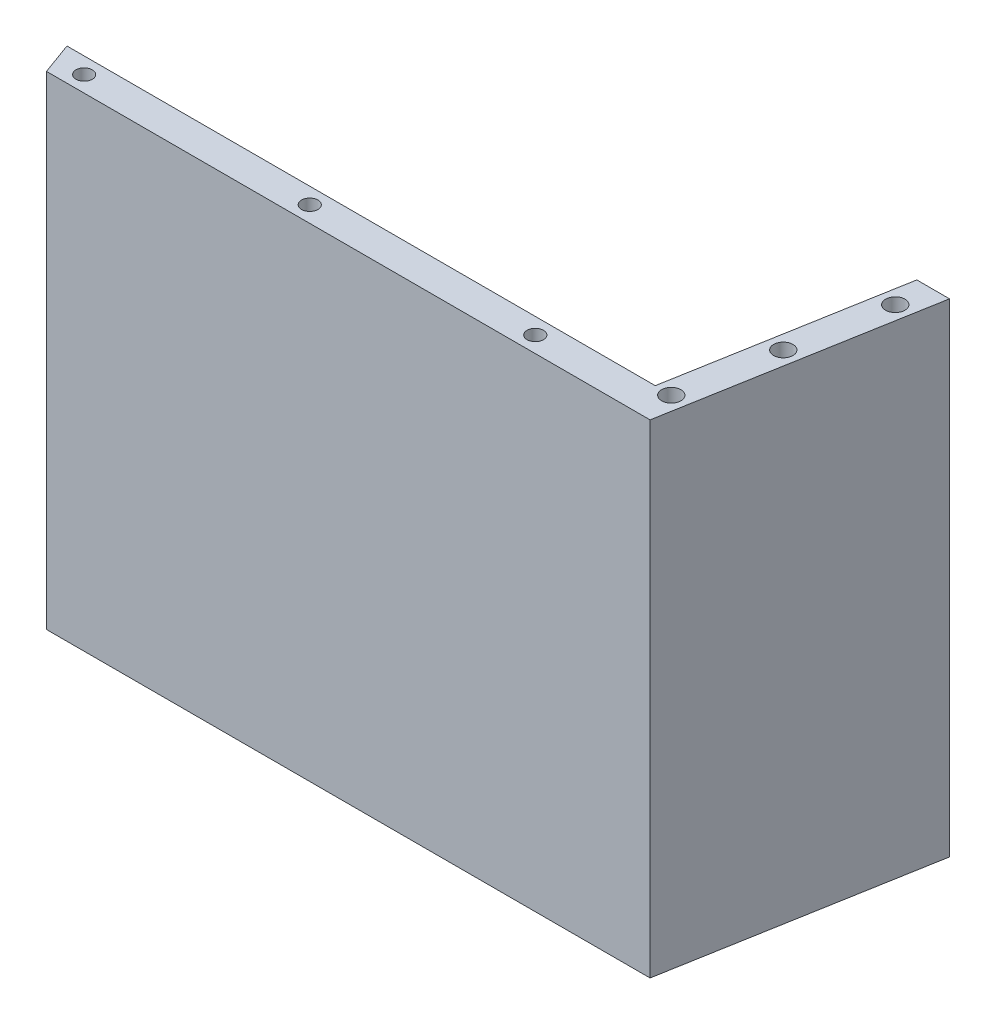
ISO-10303-21;
HEADER;
FILE_DESCRIPTION(('STEP AP214'),'2;1');
FILE_NAME('part.step','',(''),(''),'','','');
FILE_SCHEMA(('AUTOMOTIVE_DESIGN { 1 0 10303 214 1 1 1 1 }'));
ENDSEC;
DATA;
#1=APPLICATION_CONTEXT('core data for automotive mechanical design processes');
#2=APPLICATION_PROTOCOL_DEFINITION('international standard','automotive_design',2000,#1);
#3=PRODUCT_CONTEXT('',#1,'mechanical');
#4=PRODUCT('Part','Part','',(#3));
#5=PRODUCT_RELATED_PRODUCT_CATEGORY('part','',(#4));
#6=PRODUCT_DEFINITION_FORMATION('','',#4);
#7=PRODUCT_DEFINITION_CONTEXT('part definition',#1,'design');
#8=PRODUCT_DEFINITION('design','',#6,#7);
#9=PRODUCT_DEFINITION_SHAPE('','',#8);
#10=(LENGTH_UNIT() NAMED_UNIT(*) SI_UNIT(.MILLI.,.METRE.));
#11=(NAMED_UNIT(*) PLANE_ANGLE_UNIT() SI_UNIT($,.RADIAN.));
#12=(NAMED_UNIT(*) SI_UNIT($,.STERADIAN.) SOLID_ANGLE_UNIT());
#13=UNCERTAINTY_MEASURE_WITH_UNIT(LENGTH_MEASURE(1.E-05),#10,'distance_accuracy_value','');
#14=(GEOMETRIC_REPRESENTATION_CONTEXT(3) GLOBAL_UNCERTAINTY_ASSIGNED_CONTEXT((#13)) GLOBAL_UNIT_ASSIGNED_CONTEXT((#10,
#11,#12)) REPRESENTATION_CONTEXT('',''));
#15=CARTESIAN_POINT('',(0.,0.,0.));
#16=DIRECTION('',(0.,0.,1.));
#17=DIRECTION('',(1.,0.,0.));
#18=AXIS2_PLACEMENT_3D('',#15,#16,#17);
#19=CARTESIAN_POINT('',(72.4910535791554,37.5,-52.5));
#20=DIRECTION('',(0.,0.,1.));
#21=DIRECTION('',(1.,0.,0.));
#22=AXIS2_PLACEMENT_3D('',#19,#20,#21);
#23=PLANE('',#22);
#24=DIRECTION('',(0.,-1.,0.));
#25=VECTOR('',#24,1.);
#26=CARTESIAN_POINT('',(72.4910535791554,37.5,-52.5));
#27=LINE('',#26,#25);
#28=CARTESIAN_POINT('',(72.4910535791554,37.5,-52.5));
#29=VERTEX_POINT('',#28);
#30=CARTESIAN_POINT('',(72.4910535791554,-37.5,-52.5));
#31=VERTEX_POINT('',#30);
#32=EDGE_CURVE('E116',#29,#31,#27,.T.);
#33=ORIENTED_EDGE('',*,*,#32,.T.);
#34=DIRECTION('',(-1.,0.,0.));
#35=VECTOR('',#34,1.);
#36=CARTESIAN_POINT('',(72.4910535791554,-37.5,-52.5));
#37=LINE('',#36,#35);
#38=CARTESIAN_POINT('',(67.4139205197266,-37.5,-52.5));
#39=VERTEX_POINT('',#38);
#40=EDGE_CURVE('E110',#31,#39,#37,.T.);
#41=ORIENTED_EDGE('',*,*,#40,.T.);
#42=DIRECTION('',(0.,-1.,0.));
#43=VECTOR('',#42,1.);
#44=CARTESIAN_POINT('',(67.4139205197266,37.5,-52.5));
#45=LINE('',#44,#43);
#46=CARTESIAN_POINT('',(67.4139205197266,37.5,-52.5));
#47=VERTEX_POINT('',#46);
#48=EDGE_CURVE('E11',#47,#39,#45,.T.);
#49=ORIENTED_EDGE('',*,*,#48,.F.);
#50=DIRECTION('',(-1.,0.,0.));
#51=VECTOR('',#50,1.);
#52=CARTESIAN_POINT('',(72.4910535791554,37.5,-52.5));
#53=LINE('',#52,#51);
#54=EDGE_CURVE('E185',#29,#47,#53,.T.);
#55=ORIENTED_EDGE('',*,*,#54,.F.);
#56=EDGE_LOOP('',(#33,#41,#49,#55));
#57=FACE_BOUND('',#56,.T.);
#58=ADVANCED_FACE('F45',(#57),#23,.F.);
#59=CARTESIAN_POINT('',(61.3306396852845,37.5,-18.));
#60=DIRECTION('',(0.984807753012207,0.,0.173648177666934));
#61=DIRECTION('',(0.173648177666934,0.,-0.984807753012208));
#62=AXIS2_PLACEMENT_3D('',#59,#60,#61);
#63=PLANE('',#62);
#64=ORIENTED_EDGE('',*,*,#48,.T.);
#65=DIRECTION('',(-0.173648177666934,0.,0.984807753012207));
#66=VECTOR('',#65,1.);
#67=CARTESIAN_POINT('',(61.3306396852845,-37.5,-18.));
#68=LINE('',#67,#66);
#69=CARTESIAN_POINT('',(61.3306396852845,-37.5,-18.));
#70=VERTEX_POINT('',#69);
#71=EDGE_CURVE('E100',#39,#70,#68,.T.);
#72=ORIENTED_EDGE('',*,*,#71,.T.);
#73=DIRECTION('',(0.,-1.,0.));
#74=VECTOR('',#73,1.);
#75=CARTESIAN_POINT('',(61.3306396852845,37.5,-18.));
#76=LINE('',#75,#74);
#77=CARTESIAN_POINT('',(61.3306396852845,37.5,-18.));
#78=VERTEX_POINT('',#77);
#79=EDGE_CURVE('E53',#78,#70,#76,.T.);
#80=ORIENTED_EDGE('',*,*,#79,.F.);
#81=DIRECTION('',(-0.173648177666934,0.,0.984807753012207));
#82=VECTOR('',#81,1.);
#83=CARTESIAN_POINT('',(61.3306396852845,37.5,-18.));
#84=LINE('',#83,#82);
#85=EDGE_CURVE('E101',#47,#78,#84,.T.);
#86=ORIENTED_EDGE('',*,*,#85,.F.);
#87=EDGE_LOOP('',(#64,#72,#80,#86));
#88=FACE_BOUND('',#87,.T.);
#89=ADVANCED_FACE('F98',(#88),#63,.F.);
#90=CARTESIAN_POINT('',(-29.9519733386605,37.5,-18.));
#91=DIRECTION('',(0.,0.,1.));
#92=DIRECTION('',(1.,0.,0.));
#93=AXIS2_PLACEMENT_3D('',#90,#91,#92);
#94=PLANE('',#93);
#95=ORIENTED_EDGE('',*,*,#79,.T.);
#96=DIRECTION('',(-1.,0.,0.));
#97=VECTOR('',#96,1.);
#98=CARTESIAN_POINT('',(-29.9519733386605,-37.5,-18.));
#99=LINE('',#98,#97);
#100=CARTESIAN_POINT('',(-29.9519733386605,-37.5,-18.));
#101=VERTEX_POINT('',#100);
#102=EDGE_CURVE('E113',#70,#101,#99,.T.);
#103=ORIENTED_EDGE('',*,*,#102,.T.);
#104=DIRECTION('',(0.,-1.,0.));
#105=VECTOR('',#104,1.);
#106=CARTESIAN_POINT('',(-29.9519733386605,37.5,-18.));
#107=LINE('',#106,#105);
#108=CARTESIAN_POINT('',(-29.9519733386605,37.5,-18.));
#109=VERTEX_POINT('',#108);
#110=EDGE_CURVE('E211',#109,#101,#107,.T.);
#111=ORIENTED_EDGE('',*,*,#110,.F.);
#112=DIRECTION('',(-1.,0.,0.));
#113=VECTOR('',#112,1.);
#114=CARTESIAN_POINT('',(-29.9519733386605,37.5,-18.));
#115=LINE('',#114,#113);
#116=EDGE_CURVE('E193',#78,#109,#115,.T.);
#117=ORIENTED_EDGE('',*,*,#116,.F.);
#118=EDGE_LOOP('',(#95,#103,#111,#117));
#119=FACE_BOUND('',#118,.T.);
#120=ADVANCED_FACE('F216',(#119),#94,.F.);
#121=CARTESIAN_POINT('',(-28.1321221673295,37.5,-13.));
#122=DIRECTION('',(0.939692620785907,0.,-0.342020143325673));
#123=DIRECTION('',(-0.342020143325673,0.,-0.939692620785907));
#124=AXIS2_PLACEMENT_3D('',#121,#122,#123);
#125=PLANE('',#124);
#126=ORIENTED_EDGE('',*,*,#110,.T.);
#127=DIRECTION('',(0.342020143325673,0.,0.939692620785907));
#128=VECTOR('',#127,1.);
#129=CARTESIAN_POINT('',(-28.1321221673295,-37.5,-13.));
#130=LINE('',#129,#128);
#131=CARTESIAN_POINT('',(-28.1321221673295,-37.5,-13.));
#132=VERTEX_POINT('',#131);
#133=EDGE_CURVE('E129',#101,#132,#130,.T.);
#134=ORIENTED_EDGE('',*,*,#133,.T.);
#135=DIRECTION('',(0.,-1.,0.));
#136=VECTOR('',#135,1.);
#137=CARTESIAN_POINT('',(-28.1321221673295,37.5,-13.));
#138=LINE('',#137,#136);
#139=CARTESIAN_POINT('',(-28.1321221673295,37.5,-13.));
#140=VERTEX_POINT('',#139);
#141=EDGE_CURVE('E208',#140,#132,#138,.T.);
#142=ORIENTED_EDGE('',*,*,#141,.F.);
#143=DIRECTION('',(0.342020143325673,0.,0.939692620785907));
#144=VECTOR('',#143,1.);
#145=CARTESIAN_POINT('',(-28.1321221673295,37.5,-13.));
#146=LINE('',#145,#144);
#147=EDGE_CURVE('E196',#109,#140,#146,.T.);
#148=ORIENTED_EDGE('',*,*,#147,.F.);
#149=EDGE_LOOP('',(#126,#134,#142,#148));
#150=FACE_BOUND('',#149,.T.);
#151=ADVANCED_FACE('F222',(#150),#125,.F.);
#152=CARTESIAN_POINT('',(-28.1321221673295,37.5,-13.));
#153=DIRECTION('',(0.,0.,-1.));
#154=DIRECTION('',(-1.,0.,0.));
#155=AXIS2_PLACEMENT_3D('',#152,#153,#154);
#156=PLANE('',#155);
#157=ORIENTED_EDGE('',*,*,#141,.T.);
#158=DIRECTION('',(1.,0.,0.));
#159=VECTOR('',#158,1.);
#160=CARTESIAN_POINT('',(-28.1321221673295,-37.5,-13.));
#161=LINE('',#160,#159);
#162=CARTESIAN_POINT('',(65.5261378411708,-37.5,-13.));
#163=VERTEX_POINT('',#162);
#164=EDGE_CURVE('E133',#132,#163,#161,.T.);
#165=ORIENTED_EDGE('',*,*,#164,.T.);
#166=DIRECTION('',(0.,-1.,0.));
#167=VECTOR('',#166,1.);
#168=CARTESIAN_POINT('',(65.5261378411708,37.5,-13.));
#169=LINE('',#168,#167);
#170=CARTESIAN_POINT('',(65.5261378411708,37.5,-13.));
#171=VERTEX_POINT('',#170);
#172=EDGE_CURVE('E205',#171,#163,#169,.T.);
#173=ORIENTED_EDGE('',*,*,#172,.F.);
#174=DIRECTION('',(1.,0.,0.));
#175=VECTOR('',#174,1.);
#176=CARTESIAN_POINT('',(-28.1321221673295,37.5,-13.));
#177=LINE('',#176,#175);
#178=EDGE_CURVE('E65',#140,#171,#177,.T.);
#179=ORIENTED_EDGE('',*,*,#178,.F.);
#180=EDGE_LOOP('',(#157,#165,#173,#179));
#181=FACE_BOUND('',#180,.T.);
#182=ADVANCED_FACE('F225',(#181),#156,.F.);
#183=CARTESIAN_POINT('',(65.5261378411708,37.5,-13.));
#184=DIRECTION('',(-0.984807753012207,0.,-0.173648177666934));
#185=DIRECTION('',(-0.173648177666934,0.,0.984807753012208));
#186=AXIS2_PLACEMENT_3D('',#183,#184,#185);
#187=PLANE('',#186);
#188=ORIENTED_EDGE('',*,*,#172,.T.);
#189=DIRECTION('',(0.173648177666934,0.,-0.984807753012207));
#190=VECTOR('',#189,1.);
#191=CARTESIAN_POINT('',(65.5261378411708,-37.5,-13.));
#192=LINE('',#191,#190);
#193=EDGE_CURVE('E137',#163,#31,#192,.T.);
#194=ORIENTED_EDGE('',*,*,#193,.T.);
#195=ORIENTED_EDGE('',*,*,#32,.F.);
#196=DIRECTION('',(0.173648177666934,0.,-0.984807753012207));
#197=VECTOR('',#196,1.);
#198=CARTESIAN_POINT('',(65.5261378411708,37.5,-13.));
#199=LINE('',#198,#197);
#200=EDGE_CURVE('E60',#171,#29,#199,.T.);
#201=ORIENTED_EDGE('',*,*,#200,.F.);
#202=EDGE_LOOP('',(#188,#194,#195,#201));
#203=FACE_BOUND('',#202,.T.);
#204=ADVANCED_FACE('F227',(#203),#187,.F.);
#205=CARTESIAN_POINT('',(0.,37.5,0.));
#206=DIRECTION('',(0.,-1.,0.));
#207=DIRECTION('',(0.,0.,-1.));
#208=AXIS2_PLACEMENT_3D('',#205,#206,#207);
#209=PLANE('',#208);
#210=CARTESIAN_POINT('',(10.2146633369087,37.5,-15.5));
#211=DIRECTION('',(0.,1.,0.));
#212=DIRECTION('',(0.,0.,1.));
#213=AXIS2_PLACEMENT_3D('',#210,#211,#212);
#214=CIRCLE('',#213,1.27158999222515);
#215=CARTESIAN_POINT('',(10.2146633369087,37.5,-14.2284100077748));
#216=VERTEX_POINT('',#215);
#217=EDGE_CURVE('E149',#216,#216,#214,.T.);
#218=ORIENTED_EDGE('',*,*,#217,.F.);
#219=EDGE_LOOP('',(#218));
#220=FACE_BOUND('',#219,.T.);
#221=CARTESIAN_POINT('',(-24.7853366630913,37.5,-15.5));
#222=DIRECTION('',(0.,1.,0.));
#223=DIRECTION('',(0.,0.,1.));
#224=AXIS2_PLACEMENT_3D('',#221,#222,#223);
#225=CIRCLE('',#224,1.27158999222515);
#226=CARTESIAN_POINT('',(-24.7853366630913,37.5,-14.2284100077748));
#227=VERTEX_POINT('',#226);
#228=EDGE_CURVE('E158',#227,#227,#225,.T.);
#229=ORIENTED_EDGE('',*,*,#228,.F.);
#230=EDGE_LOOP('',(#229));
#231=FACE_BOUND('',#230,.T.);
#232=CARTESIAN_POINT('',(69.0708521458987,37.5,-47.5));
#233=DIRECTION('',(0.,1.,0.));
#234=DIRECTION('',(0.,0.,1.));
#235=AXIS2_PLACEMENT_3D('',#232,#233,#234);
#236=CIRCLE('',#235,1.5);
#237=CARTESIAN_POINT('',(69.0708521458987,37.5,-46.));
#238=VERTEX_POINT('',#237);
#239=EDGE_CURVE('E166',#238,#238,#236,.T.);
#240=ORIENTED_EDGE('',*,*,#239,.F.);
#241=EDGE_LOOP('',(#240));
#242=FACE_BOUND('',#241,.T.);
#243=CARTESIAN_POINT('',(66.4661294808946,37.5,-32.7278837048169));
#244=DIRECTION('',(0.,1.,0.));
#245=DIRECTION('',(0.,0.,1.));
#246=AXIS2_PLACEMENT_3D('',#243,#244,#245);
#247=CIRCLE('',#246,1.5);
#248=CARTESIAN_POINT('',(66.4661294808946,37.5,-31.2278837048169));
#249=VERTEX_POINT('',#248);
#250=EDGE_CURVE('E174',#249,#249,#247,.T.);
#251=ORIENTED_EDGE('',*,*,#250,.F.);
#252=EDGE_LOOP('',(#251));
#253=FACE_BOUND('',#252,.T.);
#254=CARTESIAN_POINT('',(63.8614068158906,37.5,-17.9557674096338));
#255=DIRECTION('',(0.,1.,0.));
#256=DIRECTION('',(0.,0.,1.));
#257=AXIS2_PLACEMENT_3D('',#254,#255,#256);
#258=CIRCLE('',#257,1.5);
#259=CARTESIAN_POINT('',(63.8614068158906,37.5,-16.4557674096338));
#260=VERTEX_POINT('',#259);
#261=EDGE_CURVE('E141',#260,#260,#258,.T.);
#262=ORIENTED_EDGE('',*,*,#261,.F.);
#263=EDGE_LOOP('',(#262));
#264=FACE_BOUND('',#263,.T.);
#265=CARTESIAN_POINT('',(45.2146633369087,37.5,-15.5));
#266=DIRECTION('',(0.,1.,0.));
#267=DIRECTION('',(0.,0.,1.));
#268=AXIS2_PLACEMENT_3D('',#265,#266,#267);
#269=CIRCLE('',#268,1.27158999222515);
#270=CARTESIAN_POINT('',(45.2146633369087,37.5,-14.2284100077749));
#271=VERTEX_POINT('',#270);
#272=EDGE_CURVE('E153',#271,#271,#269,.T.);
#273=ORIENTED_EDGE('',*,*,#272,.F.);
#274=EDGE_LOOP('',(#273));
#275=FACE_BOUND('',#274,.T.);
#276=ORIENTED_EDGE('',*,*,#54,.T.);
#277=ORIENTED_EDGE('',*,*,#85,.T.);
#278=ORIENTED_EDGE('',*,*,#116,.T.);
#279=ORIENTED_EDGE('',*,*,#147,.T.);
#280=ORIENTED_EDGE('',*,*,#178,.T.);
#281=ORIENTED_EDGE('',*,*,#200,.T.);
#282=EDGE_LOOP('',(#276,#277,#278,#279,#280,#281));
#283=FACE_BOUND('',#282,.T.);
#284=ADVANCED_FACE('F219',(#220,#231,#242,#253,#264,#275,#283),#209,.F.);
#285=CARTESIAN_POINT('',(45.2146633369087,22.5,-15.5));
#286=DIRECTION('',(0.,1.,0.));
#287=DIRECTION('',(0.,0.,1.));
#288=AXIS2_PLACEMENT_3D('',#285,#286,#287);
#289=CYLINDRICAL_SURFACE('',#288,1.27158999222515);
#290=CARTESIAN_POINT('',(45.2146633369087,22.5,-15.5));
#291=DIRECTION('',(0.,1.,0.));
#292=DIRECTION('',(0.,0.,1.));
#293=AXIS2_PLACEMENT_3D('',#290,#291,#292);
#294=CIRCLE('',#293,1.27158999222515);
#295=CARTESIAN_POINT('',(45.2146633369087,22.5,-14.2284100077749));
#296=VERTEX_POINT('',#295);
#297=EDGE_CURVE('E181',#296,#296,#294,.T.);
#298=ORIENTED_EDGE('',*,*,#297,.F.);
#299=EDGE_LOOP('',(#298));
#300=FACE_BOUND('',#299,.T.);
#301=ORIENTED_EDGE('',*,*,#272,.T.);
#302=EDGE_LOOP('',(#301));
#303=FACE_BOUND('',#302,.T.);
#304=ADVANCED_FACE('F235',(#300,#303),#289,.F.);
#305=CARTESIAN_POINT('',(0.,22.5,0.));
#306=DIRECTION('',(0.,1.,0.));
#307=DIRECTION('',(0.,0.,1.));
#308=AXIS2_PLACEMENT_3D('',#305,#306,#307);
#309=PLANE('',#308);
#310=ORIENTED_EDGE('',*,*,#297,.T.);
#311=EDGE_LOOP('',(#310));
#312=FACE_BOUND('',#311,.T.);
#313=ADVANCED_FACE('F406',(#312),#309,.T.);
#314=CARTESIAN_POINT('',(63.8614068158906,22.5,-17.9557674096338));
#315=DIRECTION('',(0.,1.,0.));
#316=DIRECTION('',(0.,0.,1.));
#317=AXIS2_PLACEMENT_3D('',#314,#315,#316);
#318=CYLINDRICAL_SURFACE('',#317,1.5);
#319=CARTESIAN_POINT('',(63.8614068158906,22.5,-17.9557674096338));
#320=DIRECTION('',(0.,1.,0.));
#321=DIRECTION('',(0.,0.,1.));
#322=AXIS2_PLACEMENT_3D('',#319,#320,#321);
#323=CIRCLE('',#322,1.5);
#324=CARTESIAN_POINT('',(63.8614068158906,22.5,-16.4557674096338));
#325=VERTEX_POINT('',#324);
#326=EDGE_CURVE('E140',#325,#325,#323,.T.);
#327=ORIENTED_EDGE('',*,*,#326,.F.);
#328=EDGE_LOOP('',(#327));
#329=FACE_BOUND('',#328,.T.);
#330=ORIENTED_EDGE('',*,*,#261,.T.);
#331=EDGE_LOOP('',(#330));
#332=FACE_BOUND('',#331,.T.);
#333=ADVANCED_FACE('F402',(#329,#332),#318,.F.);
#334=CARTESIAN_POINT('',(63.8614068158906,22.5,-17.9557674096338));
#335=DIRECTION('',(0.,1.,0.));
#336=DIRECTION('',(0.,0.,1.));
#337=AXIS2_PLACEMENT_3D('',#334,#335,#336);
#338=PLANE('',#337);
#339=ORIENTED_EDGE('',*,*,#326,.T.);
#340=EDGE_LOOP('',(#339));
#341=FACE_BOUND('',#340,.T.);
#342=ADVANCED_FACE('F405',(#341),#338,.T.);
#343=CARTESIAN_POINT('',(66.4661294808946,22.5,-32.7278837048169));
#344=DIRECTION('',(0.,1.,0.));
#345=DIRECTION('',(0.,0.,1.));
#346=AXIS2_PLACEMENT_3D('',#343,#344,#345);
#347=CYLINDRICAL_SURFACE('',#346,1.5);
#348=CARTESIAN_POINT('',(66.4661294808946,22.5,-32.7278837048169));
#349=DIRECTION('',(0.,1.,0.));
#350=DIRECTION('',(0.,0.,1.));
#351=AXIS2_PLACEMENT_3D('',#348,#349,#350);
#352=CIRCLE('',#351,1.5);
#353=CARTESIAN_POINT('',(66.4661294808946,22.5,-31.2278837048169));
#354=VERTEX_POINT('',#353);
#355=EDGE_CURVE('E145',#354,#354,#352,.T.);
#356=ORIENTED_EDGE('',*,*,#355,.F.);
#357=EDGE_LOOP('',(#356));
#358=FACE_BOUND('',#357,.T.);
#359=ORIENTED_EDGE('',*,*,#250,.T.);
#360=EDGE_LOOP('',(#359));
#361=FACE_BOUND('',#360,.T.);
#362=ADVANCED_FACE('F410',(#358,#361),#347,.F.);
#363=CARTESIAN_POINT('',(66.4661294808946,22.5,-32.7278837048169));
#364=DIRECTION('',(0.,1.,0.));
#365=DIRECTION('',(0.,0.,1.));
#366=AXIS2_PLACEMENT_3D('',#363,#364,#365);
#367=PLANE('',#366);
#368=ORIENTED_EDGE('',*,*,#355,.T.);
#369=EDGE_LOOP('',(#368));
#370=FACE_BOUND('',#369,.T.);
#371=ADVANCED_FACE('F430',(#370),#367,.T.);
#372=CARTESIAN_POINT('',(69.0708521458987,22.5,-47.5));
#373=DIRECTION('',(0.,1.,0.));
#374=DIRECTION('',(0.,0.,1.));
#375=AXIS2_PLACEMENT_3D('',#372,#373,#374);
#376=CYLINDRICAL_SURFACE('',#375,1.5);
#377=CARTESIAN_POINT('',(69.0708521458987,22.5,-47.5));
#378=DIRECTION('',(0.,1.,0.));
#379=DIRECTION('',(0.,0.,1.));
#380=AXIS2_PLACEMENT_3D('',#377,#378,#379);
#381=CIRCLE('',#380,1.5);
#382=CARTESIAN_POINT('',(69.0708521458987,22.5,-46.));
#383=VERTEX_POINT('',#382);
#384=EDGE_CURVE('E170',#383,#383,#381,.T.);
#385=ORIENTED_EDGE('',*,*,#384,.F.);
#386=EDGE_LOOP('',(#385));
#387=FACE_BOUND('',#386,.T.);
#388=ORIENTED_EDGE('',*,*,#239,.T.);
#389=EDGE_LOOP('',(#388));
#390=FACE_BOUND('',#389,.T.);
#391=ADVANCED_FACE('F427',(#387,#390),#376,.F.);
#392=CARTESIAN_POINT('',(69.0708521458987,22.5,-47.5));
#393=DIRECTION('',(0.,1.,0.));
#394=DIRECTION('',(0.,0.,1.));
#395=AXIS2_PLACEMENT_3D('',#392,#393,#394);
#396=PLANE('',#395);
#397=ORIENTED_EDGE('',*,*,#384,.T.);
#398=EDGE_LOOP('',(#397));
#399=FACE_BOUND('',#398,.T.);
#400=ADVANCED_FACE('F422',(#399),#396,.T.);
#401=CARTESIAN_POINT('',(-24.7853366630913,22.5,-15.5));
#402=DIRECTION('',(0.,1.,0.));
#403=DIRECTION('',(0.,0.,1.));
#404=AXIS2_PLACEMENT_3D('',#401,#402,#403);
#405=CYLINDRICAL_SURFACE('',#404,1.27158999222515);
#406=CARTESIAN_POINT('',(-24.7853366630913,22.5,-15.5));
#407=DIRECTION('',(0.,1.,0.));
#408=DIRECTION('',(0.,0.,1.));
#409=AXIS2_PLACEMENT_3D('',#406,#407,#408);
#410=CIRCLE('',#409,1.27158999222515);
#411=CARTESIAN_POINT('',(-24.7853366630913,22.5,-14.2284100077748));
#412=VERTEX_POINT('',#411);
#413=EDGE_CURVE('E162',#412,#412,#410,.T.);
#414=ORIENTED_EDGE('',*,*,#413,.F.);
#415=EDGE_LOOP('',(#414));
#416=FACE_BOUND('',#415,.T.);
#417=ORIENTED_EDGE('',*,*,#228,.T.);
#418=EDGE_LOOP('',(#417));
#419=FACE_BOUND('',#418,.T.);
#420=ADVANCED_FACE('F419',(#416,#419),#405,.F.);
#421=CARTESIAN_POINT('',(0.,22.5,0.));
#422=DIRECTION('',(0.,1.,0.));
#423=DIRECTION('',(0.,0.,1.));
#424=AXIS2_PLACEMENT_3D('',#421,#422,#423);
#425=PLANE('',#424);
#426=ORIENTED_EDGE('',*,*,#413,.T.);
#427=EDGE_LOOP('',(#426));
#428=FACE_BOUND('',#427,.T.);
#429=ADVANCED_FACE('F415',(#428),#425,.T.);
#430=CARTESIAN_POINT('',(10.2146633369087,22.5,-15.5));
#431=DIRECTION('',(0.,1.,0.));
#432=DIRECTION('',(0.,0.,1.));
#433=AXIS2_PLACEMENT_3D('',#430,#431,#432);
#434=CYLINDRICAL_SURFACE('',#433,1.27158999222515);
#435=CARTESIAN_POINT('',(10.2146633369087,22.5,-15.5));
#436=DIRECTION('',(0.,1.,0.));
#437=DIRECTION('',(0.,0.,1.));
#438=AXIS2_PLACEMENT_3D('',#435,#436,#437);
#439=CIRCLE('',#438,1.27158999222515);
#440=CARTESIAN_POINT('',(10.2146633369087,22.5,-14.2284100077748));
#441=VERTEX_POINT('',#440);
#442=EDGE_CURVE('E154',#441,#441,#439,.T.);
#443=ORIENTED_EDGE('',*,*,#442,.F.);
#444=EDGE_LOOP('',(#443));
#445=FACE_BOUND('',#444,.T.);
#446=ORIENTED_EDGE('',*,*,#217,.T.);
#447=EDGE_LOOP('',(#446));
#448=FACE_BOUND('',#447,.T.);
#449=ADVANCED_FACE('F412',(#445,#448),#434,.F.);
#450=CARTESIAN_POINT('',(0.,22.5,0.));
#451=DIRECTION('',(0.,1.,0.));
#452=DIRECTION('',(0.,0.,1.));
#453=AXIS2_PLACEMENT_3D('',#450,#451,#452);
#454=PLANE('',#453);
#455=ORIENTED_EDGE('',*,*,#442,.T.);
#456=EDGE_LOOP('',(#455));
#457=FACE_BOUND('',#456,.T.);
#458=ADVANCED_FACE('F276',(#457),#454,.T.);
#459=CARTESIAN_POINT('',(0.,-37.5,0.));
#460=DIRECTION('',(0.,1.,0.));
#461=DIRECTION('',(0.,0.,-1.));
#462=AXIS2_PLACEMENT_3D('',#459,#460,#461);
#463=PLANE('',#462);
#464=CARTESIAN_POINT('',(10.2146633369087,-37.5,-15.5));
#465=DIRECTION('',(0.,1.,0.));
#466=DIRECTION('',(0.,0.,1.));
#467=AXIS2_PLACEMENT_3D('',#464,#465,#466);
#468=CIRCLE('',#467,1.27158999222515);
#469=CARTESIAN_POINT('',(10.2146633369087,-37.5,-14.2284100077748));
#470=VERTEX_POINT('',#469);
#471=EDGE_CURVE('E577',#470,#470,#468,.T.);
#472=ORIENTED_EDGE('',*,*,#471,.T.);
#473=EDGE_LOOP('',(#472));
#474=FACE_BOUND('',#473,.T.);
#475=CARTESIAN_POINT('',(-24.7853366630913,-37.5,-15.5));
#476=DIRECTION('',(0.,1.,0.));
#477=DIRECTION('',(0.,0.,1.));
#478=AXIS2_PLACEMENT_3D('',#475,#476,#477);
#479=CIRCLE('',#478,1.27158999222515);
#480=CARTESIAN_POINT('',(-24.7853366630913,-37.5,-14.2284100077748));
#481=VERTEX_POINT('',#480);
#482=EDGE_CURVE('E578',#481,#481,#479,.T.);
#483=ORIENTED_EDGE('',*,*,#482,.T.);
#484=EDGE_LOOP('',(#483));
#485=FACE_BOUND('',#484,.T.);
#486=CARTESIAN_POINT('',(69.0708521458987,-37.5,-47.5));
#487=DIRECTION('',(0.,1.,0.));
#488=DIRECTION('',(0.,0.,1.));
#489=AXIS2_PLACEMENT_3D('',#486,#487,#488);
#490=CIRCLE('',#489,1.5);
#491=CARTESIAN_POINT('',(69.0708521458987,-37.5,-46.));
#492=VERTEX_POINT('',#491);
#493=EDGE_CURVE('E592',#492,#492,#490,.T.);
#494=ORIENTED_EDGE('',*,*,#493,.T.);
#495=EDGE_LOOP('',(#494));
#496=FACE_BOUND('',#495,.T.);
#497=CARTESIAN_POINT('',(66.4661294808946,-37.5,-32.7278837048169));
#498=DIRECTION('',(0.,1.,0.));
#499=DIRECTION('',(0.,0.,1.));
#500=AXIS2_PLACEMENT_3D('',#497,#498,#499);
#501=CIRCLE('',#500,1.5);
#502=CARTESIAN_POINT('',(66.4661294808946,-37.5,-31.2278837048169));
#503=VERTEX_POINT('',#502);
#504=EDGE_CURVE('E600',#503,#503,#501,.T.);
#505=ORIENTED_EDGE('',*,*,#504,.T.);
#506=EDGE_LOOP('',(#505));
#507=FACE_BOUND('',#506,.T.);
#508=CARTESIAN_POINT('',(63.8614068158906,-37.5,-17.9557674096338));
#509=DIRECTION('',(0.,1.,0.));
#510=DIRECTION('',(0.,0.,1.));
#511=AXIS2_PLACEMENT_3D('',#508,#509,#510);
#512=CIRCLE('',#511,1.5);
#513=CARTESIAN_POINT('',(63.8614068158906,-37.5,-16.4557674096338));
#514=VERTEX_POINT('',#513);
#515=EDGE_CURVE('E607',#514,#514,#512,.T.);
#516=ORIENTED_EDGE('',*,*,#515,.T.);
#517=EDGE_LOOP('',(#516));
#518=FACE_BOUND('',#517,.T.);
#519=CARTESIAN_POINT('',(45.2146633369087,-37.5,-15.5));
#520=DIRECTION('',(0.,1.,0.));
#521=DIRECTION('',(0.,0.,1.));
#522=AXIS2_PLACEMENT_3D('',#519,#520,#521);
#523=CIRCLE('',#522,1.27158999222515);
#524=CARTESIAN_POINT('',(45.2146633369087,-37.5,-14.2284100077749));
#525=VERTEX_POINT('',#524);
#526=EDGE_CURVE('E123',#525,#525,#523,.T.);
#527=ORIENTED_EDGE('',*,*,#526,.T.);
#528=EDGE_LOOP('',(#527));
#529=FACE_BOUND('',#528,.T.);
#530=ORIENTED_EDGE('',*,*,#40,.F.);
#531=ORIENTED_EDGE('',*,*,#193,.F.);
#532=ORIENTED_EDGE('',*,*,#164,.F.);
#533=ORIENTED_EDGE('',*,*,#133,.F.);
#534=ORIENTED_EDGE('',*,*,#102,.F.);
#535=ORIENTED_EDGE('',*,*,#71,.F.);
#536=EDGE_LOOP('',(#530,#531,#532,#533,#534,#535));
#537=FACE_BOUND('',#536,.T.);
#538=ADVANCED_FACE('F108',(#474,#485,#496,#507,#518,#529,#537),#463,.F.);
#539=CARTESIAN_POINT('',(45.2146633369087,-22.5,-15.5));
#540=DIRECTION('',(0.,-1.,0.));
#541=DIRECTION('',(0.,0.,1.));
#542=AXIS2_PLACEMENT_3D('',#539,#540,#541);
#543=CYLINDRICAL_SURFACE('',#542,1.27158999222515);
#544=CARTESIAN_POINT('',(45.2146633369087,-22.5,-15.5));
#545=DIRECTION('',(0.,1.,0.));
#546=DIRECTION('',(0.,0.,1.));
#547=AXIS2_PLACEMENT_3D('',#544,#545,#546);
#548=CIRCLE('',#547,1.27158999222515);
#549=CARTESIAN_POINT('',(45.2146633369087,-22.5,-14.2284100077749));
#550=VERTEX_POINT('',#549);
#551=EDGE_CURVE('E119',#550,#550,#548,.T.);
#552=ORIENTED_EDGE('',*,*,#551,.T.);
#553=EDGE_LOOP('',(#552));
#554=FACE_BOUND('',#553,.T.);
#555=ORIENTED_EDGE('',*,*,#526,.F.);
#556=EDGE_LOOP('',(#555));
#557=FACE_BOUND('',#556,.T.);
#558=ADVANCED_FACE('F275',(#554,#557),#543,.F.);
#559=CARTESIAN_POINT('',(0.,-22.5,0.));
#560=DIRECTION('',(0.,-1.,0.));
#561=DIRECTION('',(0.,0.,1.));
#562=AXIS2_PLACEMENT_3D('',#559,#560,#561);
#563=PLANE('',#562);
#564=ORIENTED_EDGE('',*,*,#551,.F.);
#565=EDGE_LOOP('',(#564));
#566=FACE_BOUND('',#565,.T.);
#567=ADVANCED_FACE('F287',(#566),#563,.T.);
#568=CARTESIAN_POINT('',(63.8614068158906,-22.5,-17.9557674096338));
#569=DIRECTION('',(0.,-1.,0.));
#570=DIRECTION('',(0.,0.,1.));
#571=AXIS2_PLACEMENT_3D('',#568,#569,#570);
#572=CYLINDRICAL_SURFACE('',#571,1.5);
#573=CARTESIAN_POINT('',(63.8614068158906,-22.5,-17.9557674096338));
#574=DIRECTION('',(0.,1.,0.));
#575=DIRECTION('',(0.,0.,1.));
#576=AXIS2_PLACEMENT_3D('',#573,#574,#575);
#577=CIRCLE('',#576,1.5);
#578=CARTESIAN_POINT('',(63.8614068158906,-22.5,-16.4557674096338));
#579=VERTEX_POINT('',#578);
#580=EDGE_CURVE('E611',#579,#579,#577,.T.);
#581=ORIENTED_EDGE('',*,*,#580,.T.);
#582=EDGE_LOOP('',(#581));
#583=FACE_BOUND('',#582,.T.);
#584=ORIENTED_EDGE('',*,*,#515,.F.);
#585=EDGE_LOOP('',(#584));
#586=FACE_BOUND('',#585,.T.);
#587=ADVANCED_FACE('F297',(#583,#586),#572,.F.);
#588=CARTESIAN_POINT('',(63.8614068158906,-22.5,-17.9557674096338));
#589=DIRECTION('',(0.,-1.,0.));
#590=DIRECTION('',(0.,0.,1.));
#591=AXIS2_PLACEMENT_3D('',#588,#589,#590);
#592=PLANE('',#591);
#593=ORIENTED_EDGE('',*,*,#580,.F.);
#594=EDGE_LOOP('',(#593));
#595=FACE_BOUND('',#594,.T.);
#596=ADVANCED_FACE('F307',(#595),#592,.T.);
#597=CARTESIAN_POINT('',(66.4661294808946,-22.5,-32.7278837048169));
#598=DIRECTION('',(0.,-1.,0.));
#599=DIRECTION('',(0.,0.,1.));
#600=AXIS2_PLACEMENT_3D('',#597,#598,#599);
#601=CYLINDRICAL_SURFACE('',#600,1.5);
#602=CARTESIAN_POINT('',(66.4661294808946,-22.5,-32.7278837048169));
#603=DIRECTION('',(0.,1.,0.));
#604=DIRECTION('',(0.,0.,1.));
#605=AXIS2_PLACEMENT_3D('',#602,#603,#604);
#606=CIRCLE('',#605,1.5);
#607=CARTESIAN_POINT('',(66.4661294808946,-22.5,-31.2278837048169));
#608=VERTEX_POINT('',#607);
#609=EDGE_CURVE('E604',#608,#608,#606,.T.);
#610=ORIENTED_EDGE('',*,*,#609,.T.);
#611=EDGE_LOOP('',(#610));
#612=FACE_BOUND('',#611,.T.);
#613=ORIENTED_EDGE('',*,*,#504,.F.);
#614=EDGE_LOOP('',(#613));
#615=FACE_BOUND('',#614,.T.);
#616=ADVANCED_FACE('F317',(#612,#615),#601,.F.);
#617=CARTESIAN_POINT('',(66.4661294808946,-22.5,-32.7278837048169));
#618=DIRECTION('',(0.,-1.,0.));
#619=DIRECTION('',(0.,0.,1.));
#620=AXIS2_PLACEMENT_3D('',#617,#618,#619);
#621=PLANE('',#620);
#622=ORIENTED_EDGE('',*,*,#609,.F.);
#623=EDGE_LOOP('',(#622));
#624=FACE_BOUND('',#623,.T.);
#625=ADVANCED_FACE('F327',(#624),#621,.T.);
#626=CARTESIAN_POINT('',(69.0708521458987,-22.5,-47.5));
#627=DIRECTION('',(0.,-1.,0.));
#628=DIRECTION('',(0.,0.,1.));
#629=AXIS2_PLACEMENT_3D('',#626,#627,#628);
#630=CYLINDRICAL_SURFACE('',#629,1.5);
#631=CARTESIAN_POINT('',(69.0708521458987,-22.5,-47.5));
#632=DIRECTION('',(0.,1.,0.));
#633=DIRECTION('',(0.,0.,1.));
#634=AXIS2_PLACEMENT_3D('',#631,#632,#633);
#635=CIRCLE('',#634,1.5);
#636=CARTESIAN_POINT('',(69.0708521458987,-22.5,-46.));
#637=VERTEX_POINT('',#636);
#638=EDGE_CURVE('E596',#637,#637,#635,.T.);
#639=ORIENTED_EDGE('',*,*,#638,.T.);
#640=EDGE_LOOP('',(#639));
#641=FACE_BOUND('',#640,.T.);
#642=ORIENTED_EDGE('',*,*,#493,.F.);
#643=EDGE_LOOP('',(#642));
#644=FACE_BOUND('',#643,.T.);
#645=ADVANCED_FACE('F337',(#641,#644),#630,.F.);
#646=CARTESIAN_POINT('',(69.0708521458987,-22.5,-47.5));
#647=DIRECTION('',(0.,-1.,0.));
#648=DIRECTION('',(0.,0.,1.));
#649=AXIS2_PLACEMENT_3D('',#646,#647,#648);
#650=PLANE('',#649);
#651=ORIENTED_EDGE('',*,*,#638,.F.);
#652=EDGE_LOOP('',(#651));
#653=FACE_BOUND('',#652,.T.);
#654=ADVANCED_FACE('F347',(#653),#650,.T.);
#655=CARTESIAN_POINT('',(-24.7853366630913,-22.5,-15.5));
#656=DIRECTION('',(0.,-1.,0.));
#657=DIRECTION('',(0.,0.,1.));
#658=AXIS2_PLACEMENT_3D('',#655,#656,#657);
#659=CYLINDRICAL_SURFACE('',#658,1.27158999222515);
#660=CARTESIAN_POINT('',(-24.7853366630913,-22.5,-15.5));
#661=DIRECTION('',(0.,1.,0.));
#662=DIRECTION('',(0.,0.,1.));
#663=AXIS2_PLACEMENT_3D('',#660,#661,#662);
#664=CIRCLE('',#663,1.27158999222515);
#665=CARTESIAN_POINT('',(-24.7853366630913,-22.5,-14.2284100077748));
#666=VERTEX_POINT('',#665);
#667=EDGE_CURVE('E585',#666,#666,#664,.T.);
#668=ORIENTED_EDGE('',*,*,#667,.T.);
#669=EDGE_LOOP('',(#668));
#670=FACE_BOUND('',#669,.T.);
#671=ORIENTED_EDGE('',*,*,#482,.F.);
#672=EDGE_LOOP('',(#671));
#673=FACE_BOUND('',#672,.T.);
#674=ADVANCED_FACE('F357',(#670,#673),#659,.F.);
#675=CARTESIAN_POINT('',(0.,-22.5,0.));
#676=DIRECTION('',(0.,-1.,0.));
#677=DIRECTION('',(0.,0.,1.));
#678=AXIS2_PLACEMENT_3D('',#675,#676,#677);
#679=PLANE('',#678);
#680=ORIENTED_EDGE('',*,*,#667,.F.);
#681=EDGE_LOOP('',(#680));
#682=FACE_BOUND('',#681,.T.);
#683=ADVANCED_FACE('F367',(#682),#679,.T.);
#684=CARTESIAN_POINT('',(10.2146633369087,-22.5,-15.5));
#685=DIRECTION('',(0.,-1.,0.));
#686=DIRECTION('',(0.,0.,1.));
#687=AXIS2_PLACEMENT_3D('',#684,#685,#686);
#688=CYLINDRICAL_SURFACE('',#687,1.27158999222515);
#689=CARTESIAN_POINT('',(10.2146633369087,-22.5,-15.5));
#690=DIRECTION('',(0.,1.,0.));
#691=DIRECTION('',(0.,0.,1.));
#692=AXIS2_PLACEMENT_3D('',#689,#690,#691);
#693=CIRCLE('',#692,1.27158999222515);
#694=CARTESIAN_POINT('',(10.2146633369087,-22.5,-14.2284100077748));
#695=VERTEX_POINT('',#694);
#696=EDGE_CURVE('E575',#695,#695,#693,.T.);
#697=ORIENTED_EDGE('',*,*,#696,.T.);
#698=EDGE_LOOP('',(#697));
#699=FACE_BOUND('',#698,.T.);
#700=ORIENTED_EDGE('',*,*,#471,.F.);
#701=EDGE_LOOP('',(#700));
#702=FACE_BOUND('',#701,.T.);
#703=ADVANCED_FACE('F377',(#699,#702),#688,.F.);
#704=CARTESIAN_POINT('',(0.,-22.5,0.));
#705=DIRECTION('',(0.,-1.,0.));
#706=DIRECTION('',(0.,0.,1.));
#707=AXIS2_PLACEMENT_3D('',#704,#705,#706);
#708=PLANE('',#707);
#709=ORIENTED_EDGE('',*,*,#696,.F.);
#710=EDGE_LOOP('',(#709));
#711=FACE_BOUND('',#710,.T.);
#712=ADVANCED_FACE('F387',(#711),#708,.T.);
#713=CLOSED_SHELL('',(#58,#89,#120,#151,#182,#204,#284,#304,#313,#333,#342,#362,#371,#391,#400,
#420,#429,#449,#458,#538,#558,#567,#587,#596,#616,#625,#645,#654,#674,#683,#703,#712));
#714=MANIFOLD_SOLID_BREP('B2',#713);
#715=ADVANCED_BREP_SHAPE_REPRESENTATION('',(#18,#714),#14);
#716=SHAPE_DEFINITION_REPRESENTATION(#9,#715);
ENDSEC;
END-ISO-10303-21;
